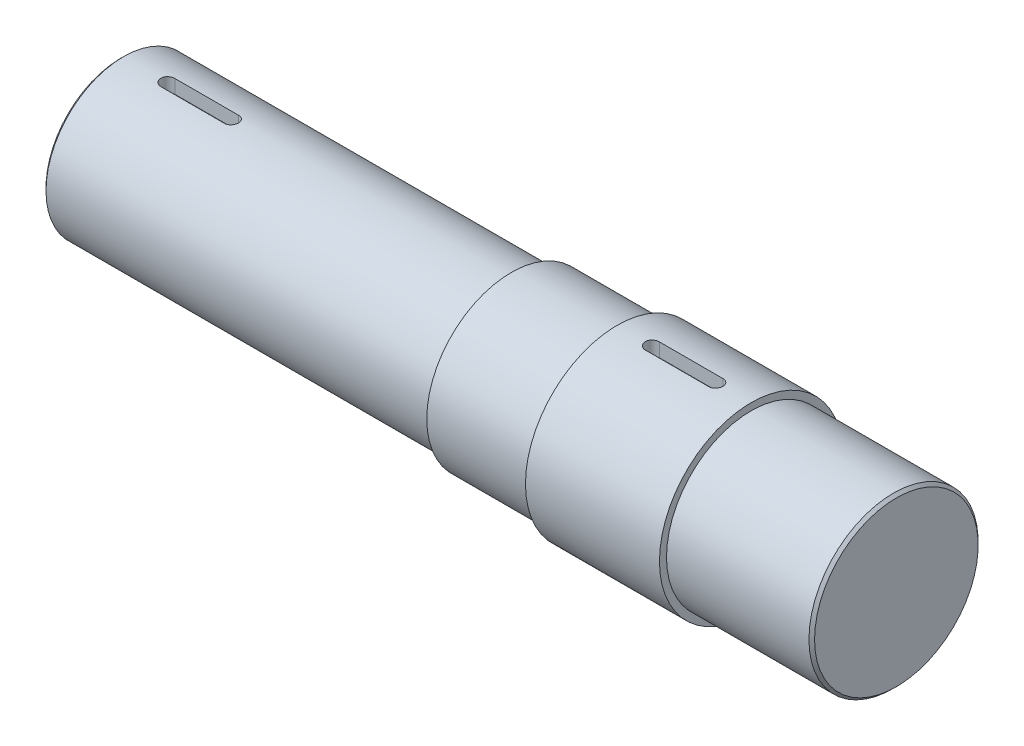
ISO-10303-21;
HEADER;
FILE_DESCRIPTION(('STEP AP214'),'2;1');
FILE_NAME('part.step','',(''),(''),'','','');
FILE_SCHEMA(('AUTOMOTIVE_DESIGN { 1 0 10303 214 1 1 1 1 }'));
ENDSEC;
DATA;
#1=APPLICATION_CONTEXT('core data for automotive mechanical design processes');
#2=APPLICATION_PROTOCOL_DEFINITION('international standard','automotive_design',2000,#1);
#3=PRODUCT_CONTEXT('',#1,'mechanical');
#4=PRODUCT('Part','Part','',(#3));
#5=PRODUCT_RELATED_PRODUCT_CATEGORY('part','',(#4));
#6=PRODUCT_DEFINITION_FORMATION('','',#4);
#7=PRODUCT_DEFINITION_CONTEXT('part definition',#1,'design');
#8=PRODUCT_DEFINITION('design','',#6,#7);
#9=PRODUCT_DEFINITION_SHAPE('','',#8);
#10=(LENGTH_UNIT() NAMED_UNIT(*) SI_UNIT(.MILLI.,.METRE.));
#11=(NAMED_UNIT(*) PLANE_ANGLE_UNIT() SI_UNIT($,.RADIAN.));
#12=(NAMED_UNIT(*) SI_UNIT($,.STERADIAN.) SOLID_ANGLE_UNIT());
#13=UNCERTAINTY_MEASURE_WITH_UNIT(LENGTH_MEASURE(1.E-05),#10,'distance_accuracy_value','');
#14=(GEOMETRIC_REPRESENTATION_CONTEXT(3) GLOBAL_UNCERTAINTY_ASSIGNED_CONTEXT((#13)) GLOBAL_UNIT_ASSIGNED_CONTEXT((#10,
#11,#12)) REPRESENTATION_CONTEXT('',''));
#15=CARTESIAN_POINT('',(0.,0.,0.));
#16=DIRECTION('',(0.,0.,1.));
#17=DIRECTION('',(1.,0.,0.));
#18=AXIS2_PLACEMENT_3D('',#15,#16,#17);
#19=CARTESIAN_POINT('',(0.,0.,0.));
#20=DIRECTION('',(-1.,0.,0.));
#21=DIRECTION('',(0.,0.,1.));
#22=AXIS2_PLACEMENT_3D('',#19,#20,#21);
#23=CYLINDRICAL_SURFACE('',#22,55.);
#24=CARTESIAN_POINT('',(277.,0.,0.));
#25=DIRECTION('',(-1.,0.,0.));
#26=DIRECTION('',(0.,0.,1.));
#27=AXIS2_PLACEMENT_3D('',#24,#25,#26);
#28=CIRCLE('',#27,55.);
#29=CARTESIAN_POINT('',(277.,0.,55.));
#30=VERTEX_POINT('',#29);
#31=EDGE_CURVE('E139',#30,#30,#28,.T.);
#32=ORIENTED_EDGE('',*,*,#31,.T.);
#33=EDGE_LOOP('',(#32));
#34=FACE_BOUND('',#33,.T.);
#35=CARTESIAN_POINT('',(1.99999999999999,0.,0.));
#36=DIRECTION('',(1.,0.,0.));
#37=DIRECTION('',(0.,0.,-1.));
#38=AXIS2_PLACEMENT_3D('',#35,#36,#37);
#39=CIRCLE('',#38,55.);
#40=CARTESIAN_POINT('',(1.99999999999999,0.,-55.));
#41=VERTEX_POINT('',#40);
#42=EDGE_CURVE('E167',#41,#41,#39,.T.);
#43=ORIENTED_EDGE('',*,*,#42,.T.);
#44=EDGE_LOOP('',(#43));
#45=FACE_BOUND('',#44,.T.);
#46=CARTESIAN_POINT('',(33.4902499755327,54.7722557505166,-5.));
#47=CARTESIAN_POINT('',(33.3499321169757,54.7722502668805,-5.00001544109722));
#48=CARTESIAN_POINT('',(33.2096168645877,54.7727947720944,-4.99409392388194));
#49=CARTESIAN_POINT('',(32.9299959325411,54.7749440965459,-4.97048879691858));
#50=CARTESIAN_POINT('',(32.7906901896279,54.7765488487584,-4.95280593068024));
#51=CARTESIAN_POINT('',(32.5141952991427,54.780777167758,-4.90581041083598));
#52=CARTESIAN_POINT('',(32.3770044111668,54.7833998445592,-4.87650791594956));
#53=CARTESIAN_POINT('',(32.105589785051,54.7895873975839,-4.80649093977446));
#54=CARTESIAN_POINT('',(31.9713660205379,54.793152265429,-4.76577655996419));
#55=CARTESIAN_POINT('',(31.7068066682247,54.8011238868613,-4.67321886613197));
#56=CARTESIAN_POINT('',(31.5764718978154,54.8055308160123,-4.62137323104368));
#57=CARTESIAN_POINT('',(31.3205914823056,54.8150623872163,-4.50690950853268));
#58=CARTESIAN_POINT('',(31.1950476255044,54.8201872939975,-4.44428744573984));
#59=CARTESIAN_POINT('',(30.9497449326892,54.8310054308812,-4.30876539400879));
#60=CARTESIAN_POINT('',(30.829983196707,54.8366983716041,-4.23587063067548));
#61=CARTESIAN_POINT('',(30.5969722736308,54.8484959633527,-4.08026691648593));
#62=CARTESIAN_POINT('',(30.4837255143265,54.85460076604,-3.99755434177018));
#63=CARTESIAN_POINT('',(30.2643401538923,54.8670618034721,-3.82272461793316));
#64=CARTESIAN_POINT('',(30.1582179765113,54.8734185688283,-3.73058689678663));
#65=CARTESIAN_POINT('',(29.9540672690979,54.8861931890398,-3.53767470847151));
#66=CARTESIAN_POINT('',(29.856041744848,54.8926110656045,-3.43689706188039));
#67=CARTESIAN_POINT('',(29.6688386072063,54.9053227200955,-3.22746610317823));
#68=CARTESIAN_POINT('',(29.5796590868612,54.9116165245328,-3.11881449725279));
#69=CARTESIAN_POINT('',(29.4107225438955,54.9239059204868,-2.89433852176803));
#70=CARTESIAN_POINT('',(29.3309690112198,54.9299014010771,-2.77851151958001));
#71=CARTESIAN_POINT('',(29.1813889063835,54.9414298436191,-2.5403765724821));
#72=CARTESIAN_POINT('',(29.1115757678484,54.9469621755827,-2.41806015821177));
#73=CARTESIAN_POINT('',(28.982479682398,54.9574003213832,-2.16790802057756));
#74=CARTESIAN_POINT('',(28.9232006424332,54.9623059025782,-2.04007027118744));
#75=CARTESIAN_POINT('',(28.8156564781675,54.9713466439967,-1.77988232007564));
#76=CARTESIAN_POINT('',(28.7673864563024,54.975482146653,-1.64753415513343));
#77=CARTESIAN_POINT('',(28.6821604760252,54.9828693572056,-1.37916942481402));
#78=CARTESIAN_POINT('',(28.6452086732369,54.9861207404376,-1.24315153194745));
#79=CARTESIAN_POINT('',(28.5830133687148,54.9916357582198,-0.96887827660991));
#80=CARTESIAN_POINT('',(28.557733647628,54.993902447039,-0.830631232317215));
#81=CARTESIAN_POINT('',(28.5188797629795,54.9974016121084,-0.552492560979599));
#82=CARTESIAN_POINT('',(28.5053096711726,54.9986337286058,-0.412600379001498));
#83=CARTESIAN_POINT('',(28.4824046268552,55.0007091235649,0.00805572211882679));
#84=CARTESIAN_POINT('',(28.490808149364,54.9999375178733,0.29009439360317));
#85=CARTESIAN_POINT('',(28.5386653619845,54.9956187209365,0.708208728630727));
#86=CARTESIAN_POINT('',(28.5604555133076,54.9936556021306,0.846626404986471));
#87=CARTESIAN_POINT('',(28.6155598924876,54.9887426133283,1.1211344634281));
#88=CARTESIAN_POINT('',(28.6488701143573,54.9857930863571,1.25722563729018));
#89=CARTESIAN_POINT('',(28.7267957622784,54.9789869007526,1.52614685238521));
#90=CARTESIAN_POINT('',(28.7714152346039,54.9751299174811,1.65897570771416));
#91=CARTESIAN_POINT('',(28.8716124804218,54.9666200584011,1.92035554928146));
#92=CARTESIAN_POINT('',(28.9271862694044,54.9619674720656,2.04890807117545));
#93=CARTESIAN_POINT('',(29.049018637502,54.9519867341246,2.30111156445695));
#94=CARTESIAN_POINT('',(29.1152967881715,54.9466573489677,2.42475303062512));
#95=CARTESIAN_POINT('',(29.257966105853,54.9354819174042,2.665970910698));
#96=CARTESIAN_POINT('',(29.3343535759036,54.9296360601293,2.78354952004053));
#97=CARTESIAN_POINT('',(29.4967478307551,54.9175882866648,3.0119058862921));
#98=CARTESIAN_POINT('',(29.5827578922439,54.9113862495408,3.122681306566));
#99=CARTESIAN_POINT('',(29.7637373368852,54.8988046622886,3.33657344208728));
#100=CARTESIAN_POINT('',(29.8587034383492,54.8924251777806,3.43969293806903));
#101=CARTESIAN_POINT('',(30.0573391900487,54.8796412013351,3.63797920941729));
#102=CARTESIAN_POINT('',(30.1610410250545,54.873236707933,3.73311374642043));
#103=CARTESIAN_POINT('',(30.376059079677,54.8606113134387,3.91427786267554));
#104=CARTESIAN_POINT('',(30.4873724892503,54.8543903457936,4.00031077250925));
#105=CARTESIAN_POINT('',(30.7169421285245,54.8423020245952,4.16275746219534));
#106=CARTESIAN_POINT('',(30.8352030194182,54.8364349139254,4.23916467337636));
#107=CARTESIAN_POINT('',(31.0777190362545,54.8252281489868,4.38172010006373));
#108=CARTESIAN_POINT('',(31.2019719150905,54.81988829924,4.44787212282865));
#109=CARTESIAN_POINT('',(31.4557778483124,54.8098803275767,4.56954606869714));
#110=CARTESIAN_POINT('',(31.5853367596576,54.8052129751311,4.62505583857091));
#111=CARTESIAN_POINT('',(31.8486519928538,54.7966927641357,4.72493123746431));
#112=CARTESIAN_POINT('',(31.982406704073,54.792839597336,4.76930108524979));
#113=CARTESIAN_POINT('',(32.2530544275722,54.7860600051886,4.84655882942857));
#114=CARTESIAN_POINT('',(32.389943872911,54.783132577677,4.87945914620053));
#115=CARTESIAN_POINT('',(32.6659719917745,54.7782840976146,4.93359216845149));
#116=CARTESIAN_POINT('',(32.8051095348616,54.7763625545593,4.95483056093913));
#117=CARTESIAN_POINT('',(33.0354885659596,54.7740686057276,4.98011102628725));
#118=CARTESIAN_POINT('',(33.1263656612475,54.7733890531006,4.98757396642762));
#119=CARTESIAN_POINT('',(33.3082420753506,54.7724826101143,4.99751500188472));
#120=CARTESIAN_POINT('',(33.3992409366275,54.7722549657277,5.00000140081968));
#121=CARTESIAN_POINT('',(33.4902499755327,54.7722557505166,5.));
#122=B_SPLINE_CURVE_WITH_KNOTS('',3,(#46,#47,#48,#49,#50,#51,#52,#53,#54,#55,#56,#57,#58,#59,
#60,#61,#62,#63,#64,#65,#66,#67,#68,#69,#70,#71,#72,#73,#74,#75,#76,#77,#78,#79,#80,#81,#82,#83,
#84,#85,#86,#87,#88,#89,#90,#91,#92,#93,#94,#95,#96,#97,#98,#99,#100,#101,#102,#103,#104,#105,
#106,#107,#108,#109,#110,#111,#112,#113,#114,#115,#116,#117,#118,#119,#120,#121),.UNSPECIFIED.,
.F.,.F.,(4,2,2,2,2,2,2,2,2,2,2,2,2,2,2,2,2,2,2,2,2,2,2,2,2,2,2,2,2,2,2,2,2,2,2,2,2,4),(0.,
0.42082387102169,0.841621141616194,1.26205132906491,1.68247777802189,2.10299197872289,
2.52366163884861,2.94411807642996,3.36473019444176,3.78628079631638,4.20798719677977,
4.62960249055763,5.05137340038744,5.47370899631445,5.8962009051893,6.31850449255451,
6.74096294853787,7.16210152478432,7.58338648336551,8.42505922213688,8.84509417341362,
9.26498320843461,9.68502268581445,10.1049096595448,10.5255732195796,10.9460833665486,
11.366737144117,11.7872373794437,12.2093609582421,12.6313295300485,13.0535845152495,
13.4756823601035,13.898259397524,14.3206761598735,14.7426340548491,15.1643859963178,
15.4378152874789,15.7107879660148),.UNSPECIFIED.);
#123=CARTESIAN_POINT('',(33.4902499755327,54.7722557505166,-5.));
#124=VERTEX_POINT('',#123);
#125=CARTESIAN_POINT('',(33.4902499755327,54.7722557505166,5.));
#126=VERTEX_POINT('',#125);
#127=EDGE_CURVE('E224',#124,#126,#122,.T.);
#128=ORIENTED_EDGE('',*,*,#127,.F.);
#129=DIRECTION('',(-1.,0.,0.));
#130=VECTOR('',#129,1.);
#131=CARTESIAN_POINT('',(0.,54.7722557505166,-5.));
#132=LINE('',#131,#130);
#133=CARTESIAN_POINT('',(78.4902499755327,54.7722557505166,-5.));
#134=VERTEX_POINT('',#133);
#135=EDGE_CURVE('E11',#134,#124,#132,.T.);
#136=ORIENTED_EDGE('',*,*,#135,.F.);
#137=CARTESIAN_POINT('',(78.4902499755327,54.7722557505166,-5.));
#138=CARTESIAN_POINT('',(78.6305678340897,54.7722502668805,-5.00001544109722));
#139=CARTESIAN_POINT('',(78.7708830864778,54.7727947720944,-4.99409392388194));
#140=CARTESIAN_POINT('',(79.0505040185244,54.7749440965459,-4.97048879691858));
#141=CARTESIAN_POINT('',(79.1898097614376,54.7765488487584,-4.95280593068024));
#142=CARTESIAN_POINT('',(79.4663046519228,54.780777167758,-4.90581041083598));
#143=CARTESIAN_POINT('',(79.6034955398986,54.7833998445592,-4.87650791594956));
#144=CARTESIAN_POINT('',(79.8749101660144,54.7895873975839,-4.80649093977446));
#145=CARTESIAN_POINT('',(80.0091339305276,54.793152265429,-4.76577655996419));
#146=CARTESIAN_POINT('',(80.2736932828408,54.8011238868613,-4.67321886613197));
#147=CARTESIAN_POINT('',(80.40402805325,54.8055308160123,-4.62137323104368));
#148=CARTESIAN_POINT('',(80.6599084687598,54.8150623872163,-4.50690950853268));
#149=CARTESIAN_POINT('',(80.7854523255611,54.8201872939975,-4.44428744573985));
#150=CARTESIAN_POINT('',(81.0307550183762,54.8310054308812,-4.3087653940088));
#151=CARTESIAN_POINT('',(81.1505167543584,54.8366983716041,-4.23587063067548));
#152=CARTESIAN_POINT('',(81.3835276774347,54.8484959633527,-4.08026691648593));
#153=CARTESIAN_POINT('',(81.4967744367389,54.85460076604,-3.99755434177018));
#154=CARTESIAN_POINT('',(81.7161597971732,54.8670618034721,-3.82272461793316));
#155=CARTESIAN_POINT('',(81.8222819745542,54.8734185688283,-3.73058689678663));
#156=CARTESIAN_POINT('',(82.0264326819676,54.8861931890398,-3.53767470847152));
#157=CARTESIAN_POINT('',(82.1244582062174,54.8926110656045,-3.4368970618804));
#158=CARTESIAN_POINT('',(82.3116613438591,54.9053227200955,-3.22746610317825));
#159=CARTESIAN_POINT('',(82.4008408642043,54.9116165245328,-3.1188144972528));
#160=CARTESIAN_POINT('',(82.5697774071699,54.9239059204868,-2.89433852176805));
#161=CARTESIAN_POINT('',(82.6495309398456,54.9299014010771,-2.77851151958002));
#162=CARTESIAN_POINT('',(82.799111044682,54.9414298436191,-2.54037657248211));
#163=CARTESIAN_POINT('',(82.8689241832171,54.9469621755827,-2.41806015821178));
#164=CARTESIAN_POINT('',(82.9980202686675,54.9574003213832,-2.16790802057758));
#165=CARTESIAN_POINT('',(83.0572993086322,54.9623059025782,-2.04007027118746));
#166=CARTESIAN_POINT('',(83.164843472898,54.9713466439967,-1.77988232007566));
#167=CARTESIAN_POINT('',(83.213113494763,54.975482146653,-1.64753415513345));
#168=CARTESIAN_POINT('',(83.2983394750402,54.9828693572056,-1.37916942481404));
#169=CARTESIAN_POINT('',(83.3352912778286,54.9861207404376,-1.24315153194746));
#170=CARTESIAN_POINT('',(83.3974865823507,54.9916357582198,-0.968878276609925));
#171=CARTESIAN_POINT('',(83.4227663034374,54.993902447039,-0.830631232317231));
#172=CARTESIAN_POINT('',(83.461620188086,54.9974016121084,-0.552492560979614));
#173=CARTESIAN_POINT('',(83.4751902798928,54.9986337286058,-0.412600379001512));
#174=CARTESIAN_POINT('',(83.4980953242102,55.0007091235649,0.00805572211881503));
#175=CARTESIAN_POINT('',(83.4896918017014,54.9999375178733,0.290094393603158));
#176=CARTESIAN_POINT('',(83.441834589081,54.9956187209365,0.708208728630717));
#177=CARTESIAN_POINT('',(83.4200444377579,54.9936556021306,0.846626404986461));
#178=CARTESIAN_POINT('',(83.3649400585778,54.9887426133283,1.12113446342809));
#179=CARTESIAN_POINT('',(83.3316298367082,54.9857930863571,1.25722563729017));
#180=CARTESIAN_POINT('',(83.2537041887871,54.9789869007526,1.5261468523852));
#181=CARTESIAN_POINT('',(83.2090847164616,54.9751299174811,1.65897570771415));
#182=CARTESIAN_POINT('',(83.1088874706436,54.9666200584011,1.92035554928146));
#183=CARTESIAN_POINT('',(83.0533136816611,54.9619674720656,2.04890807117544));
#184=CARTESIAN_POINT('',(82.9314813135634,54.9519867341246,2.30111156445694));
#185=CARTESIAN_POINT('',(82.865203162894,54.9466573489677,2.42475303062511));
#186=CARTESIAN_POINT('',(82.7225338452124,54.9354819174042,2.66597091069799));
#187=CARTESIAN_POINT('',(82.6461463751619,54.9296360601293,2.78354952004052));
#188=CARTESIAN_POINT('',(82.4837521203104,54.9175882866648,3.01190588629208));
#189=CARTESIAN_POINT('',(82.3977420588216,54.9113862495408,3.12268130656598));
#190=CARTESIAN_POINT('',(82.2167626141803,54.8988046622886,3.33657344208727));
#191=CARTESIAN_POINT('',(82.1217965127163,54.8924251777806,3.43969293806902));
#192=CARTESIAN_POINT('',(81.9231607610168,54.8796412013351,3.63797920941729));
#193=CARTESIAN_POINT('',(81.8194589260109,54.873236707933,3.73311374642042));
#194=CARTESIAN_POINT('',(81.6044408713885,54.8606113134387,3.91427786267553));
#195=CARTESIAN_POINT('',(81.4931274618152,54.8543903457936,4.00031077250925));
#196=CARTESIAN_POINT('',(81.263557822541,54.8423020245952,4.16275746219532));
#197=CARTESIAN_POINT('',(81.1452969316473,54.8364349139254,4.23916467337635));
#198=CARTESIAN_POINT('',(80.902780914811,54.8252281489868,4.38172010006371));
#199=CARTESIAN_POINT('',(80.778528035975,54.81988829924,4.44787212282864));
#200=CARTESIAN_POINT('',(80.524722102753,54.8098803275767,4.56954606869714));
#201=CARTESIAN_POINT('',(80.3951631914079,54.8052129751311,4.62505583857091));
#202=CARTESIAN_POINT('',(80.1318479582117,54.7966927641357,4.72493123746431));
#203=CARTESIAN_POINT('',(79.9980932469925,54.792839597336,4.76930108524979));
#204=CARTESIAN_POINT('',(79.7274455234933,54.7860600051886,4.84655882942857));
#205=CARTESIAN_POINT('',(79.5905560781545,54.783132577677,4.87945914620052));
#206=CARTESIAN_POINT('',(79.314527959291,54.7782840976146,4.93359216845148));
#207=CARTESIAN_POINT('',(79.1753904162039,54.7763625545593,4.95483056093913));
#208=CARTESIAN_POINT('',(78.9450113851059,54.7740686057276,4.98011102628725));
#209=CARTESIAN_POINT('',(78.8541342898179,54.7733890531006,4.98757396642762));
#210=CARTESIAN_POINT('',(78.6722578757148,54.7724826101143,4.99751500188472));
#211=CARTESIAN_POINT('',(78.5812590144379,54.7722549657277,5.00000140081968));
#212=CARTESIAN_POINT('',(78.4902499755327,54.7722557505166,5.));
#213=B_SPLINE_CURVE_WITH_KNOTS('',3,(#137,#138,#139,#140,#141,#142,#143,#144,#145,#146,#147,
#148,#149,#150,#151,#152,#153,#154,#155,#156,#157,#158,#159,#160,#161,#162,#163,#164,#165,#166,
#167,#168,#169,#170,#171,#172,#173,#174,#175,#176,#177,#178,#179,#180,#181,#182,#183,#184,#185,
#186,#187,#188,#189,#190,#191,#192,#193,#194,#195,#196,#197,#198,#199,#200,#201,#202,#203,#204,
#205,#206,#207,#208,#209,#210,#211,#212),.UNSPECIFIED.,.F.,.F.,(4,2,2,2,2,2,2,2,2,2,2,2,2,2,2,2,
2,2,2,2,2,2,2,2,2,2,2,2,2,2,2,2,2,2,2,2,2,4),(0.,0.420823871021704,0.841621141616208,
1.2620513290649,1.68247777802188,2.10299197872288,2.5236616388486,2.94411807642996,
3.36473019444176,3.78628079631638,4.20798719677976,4.62960249055761,5.05137340038743,
5.47370899631443,5.89620090518928,6.31850449255449,6.74096294853785,7.16210152478431,
7.5833864833655,8.42505922213687,8.84509417341361,9.2649832084346,9.68502268581444,
10.1049096595448,10.5255732195796,10.9460833665486,11.366737144117,11.7872373794437,
12.2093609582421,12.6313295300485,13.0535845152494,13.4756823601035,13.898259397524,
14.3206761598735,14.7426340548491,15.1643859963178,15.4378152874789,15.7107879660148),.UNSPECIFIED.);
#214=CARTESIAN_POINT('',(78.4902499755327,54.7722557505166,5.));
#215=VERTEX_POINT('',#214);
#216=EDGE_CURVE('E216',#134,#215,#213,.T.);
#217=ORIENTED_EDGE('',*,*,#216,.T.);
#218=DIRECTION('',(-1.,0.,0.));
#219=VECTOR('',#218,1.);
#220=CARTESIAN_POINT('',(0.,54.7722557505166,5.));
#221=LINE('',#220,#219);
#222=EDGE_CURVE('E44',#215,#126,#221,.T.);
#223=ORIENTED_EDGE('',*,*,#222,.T.);
#224=EDGE_LOOP('',(#128,#136,#217,#223));
#225=FACE_BOUND('',#224,.T.);
#226=ADVANCED_FACE('F36',(#34,#45,#225),#23,.T.);
#227=CARTESIAN_POINT('',(0.,0.,0.));
#228=DIRECTION('',(-1.,0.,0.));
#229=DIRECTION('',(0.,0.,1.));
#230=AXIS2_PLACEMENT_3D('',#227,#228,#229);
#231=CYLINDRICAL_SURFACE('',#230,65.);
#232=CARTESIAN_POINT('',(447.,0.,0.));
#233=DIRECTION('',(-1.,0.,0.));
#234=DIRECTION('',(0.,0.,1.));
#235=AXIS2_PLACEMENT_3D('',#232,#233,#234);
#236=CIRCLE('',#235,65.);
#237=CARTESIAN_POINT('',(447.,0.,65.));
#238=VERTEX_POINT('',#237);
#239=EDGE_CURVE('E158',#238,#238,#236,.T.);
#240=ORIENTED_EDGE('',*,*,#239,.T.);
#241=EDGE_LOOP('',(#240));
#242=FACE_BOUND('',#241,.T.);
#243=CARTESIAN_POINT('',(352.,0.,0.));
#244=DIRECTION('',(-1.,0.,0.));
#245=DIRECTION('',(0.,0.,1.));
#246=AXIS2_PLACEMENT_3D('',#243,#244,#245);
#247=CIRCLE('',#246,65.);
#248=CARTESIAN_POINT('',(352.,0.,65.));
#249=VERTEX_POINT('',#248);
#250=EDGE_CURVE('E155',#249,#249,#247,.T.);
#251=ORIENTED_EDGE('',*,*,#250,.F.);
#252=EDGE_LOOP('',(#251));
#253=FACE_BOUND('',#252,.T.);
#254=CARTESIAN_POINT('',(377.,64.8074069840786,-5.));
#255=CARTESIAN_POINT('',(376.859594385389,64.8074023551756,-5.00001535000786));
#256=CARTESIAN_POINT('',(376.7191912536,64.8078631108014,-4.99408652774138));
#257=CARTESIAN_POINT('',(376.439393562403,64.8096819189454,-4.97045161976289));
#258=CARTESIAN_POINT('',(376.299998944139,64.8110399186659,-4.95274622703354));
#259=CARTESIAN_POINT('',(376.023319197556,64.8146182748958,-4.90568863561711));
#260=CARTESIAN_POINT('',(375.886032425275,64.8168379197219,-4.87634604833895));
#261=CARTESIAN_POINT('',(375.614426694473,64.8220748519402,-4.80623084978102));
#262=CARTESIAN_POINT('',(375.480107706815,64.8250921314972,-4.76545835077682));
#263=CARTESIAN_POINT('',(375.215357239324,64.8318396227245,-4.67276436747024));
#264=CARTESIAN_POINT('',(375.084926663913,64.8355699987841,-4.62084031207091));
#265=CARTESIAN_POINT('',(374.828859832242,64.8436385922533,-4.50619969022729));
#266=CARTESIAN_POINT('',(374.703225365893,64.8479770338254,-4.4434791417174));
#267=CARTESIAN_POINT('',(374.457752351393,64.8571351886751,-4.30774153614573));
#268=CARTESIAN_POINT('',(374.337910803176,64.8619546487893,-4.23472988710659));
#269=CARTESIAN_POINT('',(374.104752873588,64.8719421824066,-4.07887420457044));
#270=CARTESIAN_POINT('',(373.991438922478,64.8771103842128,-3.99602654376242));
#271=CARTESIAN_POINT('',(373.772016258818,64.8876556011665,-3.82097472068715));
#272=CARTESIAN_POINT('',(373.665918595848,64.8930329175663,-3.72875672604966));
#273=CARTESIAN_POINT('',(373.461825163887,64.9038387929242,-3.53568366332888));
#274=CARTESIAN_POINT('',(373.363832403002,64.9092673700819,-3.43482541646755));
#275=CARTESIAN_POINT('',(373.176704756578,64.9200189480372,-3.22523570437237));
#276=CARTESIAN_POINT('',(373.08756796015,64.9253419714113,-3.1165059463986));
#277=CARTESIAN_POINT('',(372.91872766097,64.9357349904512,-2.89187905339641));
#278=CARTESIAN_POINT('',(372.839027652656,64.9408048919869,-2.775979287355));
#279=CARTESIAN_POINT('',(372.689602790967,64.9505501019168,-2.53776683499873));
#280=CARTESIAN_POINT('',(372.619886353476,64.9552250760523,-2.41544885559437));
#281=CARTESIAN_POINT('',(372.490982542369,64.9640446716844,-2.16530962048204));
#282=CARTESIAN_POINT('',(372.431799072257,64.968189096401,-2.0374863462248));
#283=CARTESIAN_POINT('',(372.324442187587,64.9758260627094,-1.77734318588319));
#284=CARTESIAN_POINT('',(372.276263918539,64.9793188916007,-1.64502531210825));
#285=CARTESIAN_POINT('',(372.191215187684,64.9855569579573,-1.37673665998182));
#286=CARTESIAN_POINT('',(372.154348883385,64.9883019205165,-1.24076455850589));
#287=CARTESIAN_POINT('',(372.092290861164,64.9929584069652,-0.966488011494478));
#288=CARTESIAN_POINT('',(372.067072071349,64.9948718628766,-0.828189756618804));
#289=CARTESIAN_POINT('',(372.028347640301,64.9978229730796,-0.549957312961379));
#290=CARTESIAN_POINT('',(372.014846074,64.998860322682,-0.410022572187263));
#291=CARTESIAN_POINT('',(371.992155611716,65.0005999767008,0.0107514264044203));
#292=CARTESIAN_POINT('',(372.000714766538,64.9999349793205,0.292853804254978));
#293=CARTESIAN_POINT('',(372.048835361242,64.996260788839,0.71116919816126));
#294=CARTESIAN_POINT('',(372.070734805228,64.9945915452053,0.849728701831299));
#295=CARTESIAN_POINT('',(372.126083432708,64.9904167160765,1.12451225954851));
#296=CARTESIAN_POINT('',(372.159528600663,64.9879114213657,1.26073710830887));
#297=CARTESIAN_POINT('',(372.237749969632,64.982132276683,1.52991535250005));
#298=CARTESIAN_POINT('',(372.282530215637,64.9788581523802,1.66286756144681));
#299=CARTESIAN_POINT('',(372.383074623856,64.9716360098702,1.92448062261232));
#300=CARTESIAN_POINT('',(372.438834777316,64.9676882376814,2.05314302104981));
#301=CARTESIAN_POINT('',(372.561040464033,64.9592229303753,2.30549832392574));
#302=CARTESIAN_POINT('',(372.627501321586,64.954704580175,2.42918377861648));
#303=CARTESIAN_POINT('',(372.770551251445,64.9452319076253,2.67047311832818));
#304=CARTESIAN_POINT('',(372.847136608733,64.9402777454121,2.78807921215766));
#305=CARTESIAN_POINT('',(373.009939387065,64.9300699533595,3.01646975085982));
#306=CARTESIAN_POINT('',(373.09616003043,64.9248162236255,3.12725189427555));
#307=CARTESIAN_POINT('',(373.277570361244,64.9141609293724,3.34113367429633));
#308=CARTESIAN_POINT('',(373.372756752784,64.908759419693,3.4442361092811));
#309=CARTESIAN_POINT('',(373.571737226183,64.8979436628168,3.64235933169006));
#310=CARTESIAN_POINT('',(373.675554913318,64.8925294228504,3.7373564138833));
#311=CARTESIAN_POINT('',(373.89079044213,64.8818590830606,3.91823552386131));
#312=CARTESIAN_POINT('',(374.002205475102,64.8766029258192,4.00412089051489));
#313=CARTESIAN_POINT('',(374.23196174368,64.866392367416,4.16626296509967));
#314=CARTESIAN_POINT('',(374.35030764551,64.8614381742402,4.24251307442662));
#315=CARTESIAN_POINT('',(374.592974296845,64.8519782386827,4.38474619420972));
#316=CARTESIAN_POINT('',(374.717292811516,64.84747233047,4.45073300642221));
#317=CARTESIAN_POINT('',(374.971201330601,64.8390307558136,4.57206685064607));
#318=CARTESIAN_POINT('',(375.100796865895,64.8350957084786,4.62740235206201));
#319=CARTESIAN_POINT('',(375.364162859338,64.8279156314631,4.72692767521658));
#320=CARTESIAN_POINT('',(375.497931719274,64.8246703412647,4.77112170621339));
#321=CARTESIAN_POINT('',(375.768585037949,64.8189640208537,4.84802947153242));
#322=CARTESIAN_POINT('',(375.905465939977,64.816502139248,4.88075567281092));
#323=CARTESIAN_POINT('',(376.181456718038,64.8124292954725,4.9345453971113));
#324=CARTESIAN_POINT('',(376.320565471234,64.8108179177424,4.95561461603376));
#325=CARTESIAN_POINT('',(376.549973015629,64.8089073794513,4.98052378608666));
#326=CARTESIAN_POINT('',(376.639907523471,64.8083449361425,4.98783190037653));
#327=CARTESIAN_POINT('',(376.819891612615,64.8075947360562,4.99756659152388));
#328=CARTESIAN_POINT('',(376.90994075269,64.8074063567063,5.00000127951192));
#329=CARTESIAN_POINT('',(377.,64.8074069840786,5.));
#330=B_SPLINE_CURVE_WITH_KNOTS('',3,(#254,#255,#256,#257,#258,#259,#260,#261,#262,#263,#264,
#265,#266,#267,#268,#269,#270,#271,#272,#273,#274,#275,#276,#277,#278,#279,#280,#281,#282,#283,
#284,#285,#286,#287,#288,#289,#290,#291,#292,#293,#294,#295,#296,#297,#298,#299,#300,#301,#302,
#303,#304,#305,#306,#307,#308,#309,#310,#311,#312,#313,#314,#315,#316,#317,#318,#319,#320,#321,
#322,#323,#324,#325,#326,#327,#328,#329),.UNSPECIFIED.,.F.,.F.,(4,2,2,2,2,2,2,2,2,2,2,2,2,2,2,2,
2,2,2,2,2,2,2,2,2,2,2,2,2,2,2,2,2,2,2,2,2,4),(0.,0.421087406559349,0.842150036766591,
1.26286562412243,1.68357707895017,2.10438563711996,2.52534973578104,2.94609343488592,
3.36699278007518,3.78852273606694,4.21020844589851,4.63180296832185,5.05355312191938,
5.47565673281538,5.89791645048798,6.31998954448485,6.74221757850417,7.16345924252506,
7.58484734430108,8.42673213288286,8.84722631357802,9.26757439576205,9.68807269362951,
10.1084177516206,10.5293702222734,10.9501686578773,11.3711082442778,11.7918936880352,
12.2138703640184,12.6356918741753,13.0578007165174,13.479752825933,13.9021591825692,
14.3244057137157,14.7461917758258,15.1677715600201,15.4383468419485,15.7084714137935),.UNSPECIFIED.);
#331=CARTESIAN_POINT('',(377.,64.8074069840786,-5.));
#332=VERTEX_POINT('',#331);
#333=CARTESIAN_POINT('',(377.,64.8074069840786,5.));
#334=VERTEX_POINT('',#333);
#335=EDGE_CURVE('E185',#332,#334,#330,.T.);
#336=ORIENTED_EDGE('',*,*,#335,.F.);
#337=DIRECTION('',(-1.,0.,0.));
#338=VECTOR('',#337,1.);
#339=CARTESIAN_POINT('',(0.,64.8074069840786,-5.));
#340=LINE('',#339,#338);
#341=CARTESIAN_POINT('',(422.,64.8074069840786,-5.));
#342=VERTEX_POINT('',#341);
#343=EDGE_CURVE('E249',#342,#332,#340,.T.);
#344=ORIENTED_EDGE('',*,*,#343,.F.);
#345=CARTESIAN_POINT('',(422.,64.8074069840786,-5.));
#346=CARTESIAN_POINT('',(422.140405614611,64.8074023551756,-5.00001535000786));
#347=CARTESIAN_POINT('',(422.2808087464,64.8078631108014,-4.99408652774137));
#348=CARTESIAN_POINT('',(422.560606437597,64.8096819189454,-4.97045161976288));
#349=CARTESIAN_POINT('',(422.700001055861,64.8110399186659,-4.95274622703352));
#350=CARTESIAN_POINT('',(422.976680802444,64.8146182748958,-4.9056886356171));
#351=CARTESIAN_POINT('',(423.113967574726,64.8168379197219,-4.87634604833894));
#352=CARTESIAN_POINT('',(423.385573305527,64.8220748519402,-4.806230849781));
#353=CARTESIAN_POINT('',(423.519892293185,64.8250921314972,-4.76545835077681));
#354=CARTESIAN_POINT('',(423.784642760676,64.8318396227245,-4.67276436747024));
#355=CARTESIAN_POINT('',(423.915073336087,64.8355699987841,-4.62084031207092));
#356=CARTESIAN_POINT('',(424.171140167758,64.8436385922533,-4.50619969022733));
#357=CARTESIAN_POINT('',(424.296774634107,64.8479770338254,-4.44347914171744));
#358=CARTESIAN_POINT('',(424.542247648607,64.8571351886751,-4.30774153614578));
#359=CARTESIAN_POINT('',(424.662089196824,64.8619546487893,-4.23472988710663));
#360=CARTESIAN_POINT('',(424.895247126412,64.8719421824066,-4.07887420457047));
#361=CARTESIAN_POINT('',(425.008561077522,64.8771103842128,-3.99602654376242));
#362=CARTESIAN_POINT('',(425.227983741182,64.8876556011665,-3.82097472068716));
#363=CARTESIAN_POINT('',(425.334081404152,64.8930329175663,-3.72875672604969));
#364=CARTESIAN_POINT('',(425.538174836113,64.9038387929242,-3.53568366332891));
#365=CARTESIAN_POINT('',(425.636167596998,64.9092673700819,-3.43482541646757));
#366=CARTESIAN_POINT('',(425.823295243422,64.9200189480372,-3.2252357043724));
#367=CARTESIAN_POINT('',(425.91243203985,64.9253419714113,-3.11650594639866));
#368=CARTESIAN_POINT('',(426.08127233903,64.9357349904512,-2.89187905339646));
#369=CARTESIAN_POINT('',(426.160972347344,64.9408048919869,-2.77597928735502));
#370=CARTESIAN_POINT('',(426.310397209033,64.9505501019168,-2.53776683499873));
#371=CARTESIAN_POINT('',(426.380113646524,64.9552250760523,-2.41544885559439));
#372=CARTESIAN_POINT('',(426.509017457631,64.9640446716844,-2.16530962048205));
#373=CARTESIAN_POINT('',(426.568200927743,64.968189096401,-2.03748634622479));
#374=CARTESIAN_POINT('',(426.675557812414,64.9758260627094,-1.77734318588317));
#375=CARTESIAN_POINT('',(426.723736081461,64.9793188916007,-1.64502531210824));
#376=CARTESIAN_POINT('',(426.808784812316,64.9855569579573,-1.37673665998182));
#377=CARTESIAN_POINT('',(426.845651116615,64.9883019205165,-1.24076455850589));
#378=CARTESIAN_POINT('',(426.907709138836,64.9929584069652,-0.966488011494475));
#379=CARTESIAN_POINT('',(426.932927928651,64.9948718628766,-0.828189756618801));
#380=CARTESIAN_POINT('',(426.971652359699,64.9978229730796,-0.549957312961378));
#381=CARTESIAN_POINT('',(426.985153926,64.998860322682,-0.410022572187262));
#382=CARTESIAN_POINT('',(427.007844388284,65.0005999767008,0.0107514264044214));
#383=CARTESIAN_POINT('',(426.999285233462,64.9999349793205,0.29285380425498));
#384=CARTESIAN_POINT('',(426.951164638758,64.996260788839,0.711169198161267));
#385=CARTESIAN_POINT('',(426.929265194773,64.9945915452053,0.84972870183131));
#386=CARTESIAN_POINT('',(426.873916567292,64.9904167160765,1.12451225954852));
#387=CARTESIAN_POINT('',(426.840471399338,64.9879114213657,1.26073710830888));
#388=CARTESIAN_POINT('',(426.762250030368,64.982132276683,1.52991535250005));
#389=CARTESIAN_POINT('',(426.717469784364,64.9788581523802,1.66286756144681));
#390=CARTESIAN_POINT('',(426.616925376144,64.9716360098702,1.92448062261233));
#391=CARTESIAN_POINT('',(426.561165222684,64.9676882376814,2.05314302104982));
#392=CARTESIAN_POINT('',(426.438959535967,64.9592229303753,2.30549832392573));
#393=CARTESIAN_POINT('',(426.372498678414,64.954704580175,2.42918377861644));
#394=CARTESIAN_POINT('',(426.229448748555,64.9452319076254,2.67047311832813));
#395=CARTESIAN_POINT('',(426.152863391267,64.9402777454121,2.78807921215763));
#396=CARTESIAN_POINT('',(425.990060612935,64.9300699533595,3.01646975085979));
#397=CARTESIAN_POINT('',(425.903839969571,64.9248162236255,3.1272518942755));
#398=CARTESIAN_POINT('',(425.722429638756,64.9141609293724,3.34113367429629));
#399=CARTESIAN_POINT('',(425.627243247216,64.908759419693,3.44423610928109));
#400=CARTESIAN_POINT('',(425.428262773817,64.8979436628168,3.64235933169008));
#401=CARTESIAN_POINT('',(425.324445086682,64.8925294228504,3.73735641388333));
#402=CARTESIAN_POINT('',(425.10920955787,64.8818590830605,3.91823552386135));
#403=CARTESIAN_POINT('',(424.997794524898,64.8766029258192,4.00412089051493));
#404=CARTESIAN_POINT('',(424.768038256321,64.866392367416,4.16626296509971));
#405=CARTESIAN_POINT('',(424.64969235449,64.8614381742402,4.24251307442665));
#406=CARTESIAN_POINT('',(424.407025703155,64.8519782386827,4.38474619420973));
#407=CARTESIAN_POINT('',(424.282707188484,64.84747233047,4.45073300642222));
#408=CARTESIAN_POINT('',(424.028798669399,64.8390307558136,4.57206685064608));
#409=CARTESIAN_POINT('',(423.899203134106,64.8350957084786,4.62740235206202));
#410=CARTESIAN_POINT('',(423.635837140662,64.8279156314631,4.7269276752166));
#411=CARTESIAN_POINT('',(423.502068280726,64.8246703412647,4.77112170621341));
#412=CARTESIAN_POINT('',(423.231414962051,64.8189640208537,4.84802947153242));
#413=CARTESIAN_POINT('',(423.094534060023,64.816502139248,4.88075567281092));
#414=CARTESIAN_POINT('',(422.818543281962,64.8124292954725,4.93454539711129));
#415=CARTESIAN_POINT('',(422.679434528766,64.8108179177424,4.95561461603377));
#416=CARTESIAN_POINT('',(422.450026984371,64.8089073794513,4.98052378608667));
#417=CARTESIAN_POINT('',(422.360092476529,64.8083449361425,4.98783190037654));
#418=CARTESIAN_POINT('',(422.180108387385,64.8075947360562,4.99756659152389));
#419=CARTESIAN_POINT('',(422.09005924731,64.8074063567063,5.00000127951192));
#420=CARTESIAN_POINT('',(422.,64.8074069840786,5.));
#421=B_SPLINE_CURVE_WITH_KNOTS('',3,(#345,#346,#347,#348,#349,#350,#351,#352,#353,#354,#355,
#356,#357,#358,#359,#360,#361,#362,#363,#364,#365,#366,#367,#368,#369,#370,#371,#372,#373,#374,
#375,#376,#377,#378,#379,#380,#381,#382,#383,#384,#385,#386,#387,#388,#389,#390,#391,#392,#393,
#394,#395,#396,#397,#398,#399,#400,#401,#402,#403,#404,#405,#406,#407,#408,#409,#410,#411,#412,
#413,#414,#415,#416,#417,#418,#419,#420),.UNSPECIFIED.,.F.,.F.,(4,2,2,2,2,2,2,2,2,2,2,2,2,2,2,2,
2,2,2,2,2,2,2,2,2,2,2,2,2,2,2,2,2,2,2,2,2,4),(0.,0.421087406559405,0.842150036766647,
1.26286562412249,1.68357707895017,2.1043856371199,2.52534973578091,2.94609343488585,
3.36699278007518,3.78852273606692,4.21020844589846,4.63180296832175,5.05355312191938,
5.47565673281535,5.897916450488,6.31998954448485,6.74221757850417,7.16345924252506,
7.58484734430108,8.42673213288287,8.84722631357804,9.26757439576205,9.68807269362952,
10.1084177516206,10.5293702222733,10.9501686578773,11.3711082442777,11.7918936880352,
12.2138703640184,12.6356918741754,13.0578007165174,13.479752825933,13.9021591825693,
14.3244057137158,14.7461917758258,15.1677715600201,15.4383468419486,15.7084714137935),.UNSPECIFIED.);
#422=CARTESIAN_POINT('',(422.,64.8074069840786,5.));
#423=VERTEX_POINT('',#422);
#424=EDGE_CURVE('E176',#342,#423,#421,.T.);
#425=ORIENTED_EDGE('',*,*,#424,.T.);
#426=DIRECTION('',(-1.,0.,0.));
#427=VECTOR('',#426,1.);
#428=CARTESIAN_POINT('',(0.,64.8074069840786,5.));
#429=LINE('',#428,#427);
#430=EDGE_CURVE('E253',#423,#334,#429,.T.);
#431=ORIENTED_EDGE('',*,*,#430,.T.);
#432=EDGE_LOOP('',(#336,#344,#425,#431));
#433=FACE_BOUND('',#432,.T.);
#434=ADVANCED_FACE('F192',(#242,#253,#433),#231,.T.);
#435=CARTESIAN_POINT('',(0.,0.,-55.));
#436=DIRECTION('',(1.,0.,0.));
#437=DIRECTION('',(0.,0.,-1.));
#438=AXIS2_PLACEMENT_3D('',#435,#436,#437);
#439=PLANE('',#438);
#440=CARTESIAN_POINT('',(0.,0.,0.));
#441=DIRECTION('',(1.,0.,0.));
#442=DIRECTION('',(0.,0.,-1.));
#443=AXIS2_PLACEMENT_3D('',#440,#441,#442);
#444=CIRCLE('',#443,53.);
#445=CARTESIAN_POINT('',(0.,0.,-53.));
#446=VERTEX_POINT('',#445);
#447=EDGE_CURVE('E164',#446,#446,#444,.F.);
#448=ORIENTED_EDGE('',*,*,#447,.T.);
#449=EDGE_LOOP('',(#448));
#450=FACE_BOUND('',#449,.T.);
#451=ADVANCED_FACE('F315',(#450),#439,.F.);
#452=CARTESIAN_POINT('',(550.,0.,0.));
#453=DIRECTION('',(-1.,0.,0.));
#454=DIRECTION('',(0.,0.,1.));
#455=AXIS2_PLACEMENT_3D('',#452,#453,#454);
#456=PLANE('',#455);
#457=CARTESIAN_POINT('',(550.,0.,0.));
#458=DIRECTION('',(-1.,0.,0.));
#459=DIRECTION('',(0.,0.,1.));
#460=AXIS2_PLACEMENT_3D('',#457,#458,#459);
#461=CIRCLE('',#460,57.9999999999999);
#462=CARTESIAN_POINT('',(550.,0.,57.9999999999999));
#463=VERTEX_POINT('',#462);
#464=EDGE_CURVE('E173',#463,#463,#461,.F.);
#465=ORIENTED_EDGE('',*,*,#464,.T.);
#466=EDGE_LOOP('',(#465));
#467=FACE_BOUND('',#466,.T.);
#468=ADVANCED_FACE('F337',(#467),#456,.F.);
#469=CARTESIAN_POINT('',(0.,0.,0.));
#470=DIRECTION('',(-1.,0.,0.));
#471=DIRECTION('',(0.,0.,1.));
#472=AXIS2_PLACEMENT_3D('',#469,#470,#471);
#473=CYLINDRICAL_SURFACE('',#472,60.);
#474=CARTESIAN_POINT('',(548.,0.,0.));
#475=DIRECTION('',(-1.,0.,0.));
#476=DIRECTION('',(0.,0.,1.));
#477=AXIS2_PLACEMENT_3D('',#474,#475,#476);
#478=CIRCLE('',#477,60.);
#479=CARTESIAN_POINT('',(548.,0.,60.));
#480=VERTEX_POINT('',#479);
#481=EDGE_CURVE('E170',#480,#480,#478,.T.);
#482=ORIENTED_EDGE('',*,*,#481,.T.);
#483=EDGE_LOOP('',(#482));
#484=FACE_BOUND('',#483,.T.);
#485=CARTESIAN_POINT('',(447.,0.,0.));
#486=DIRECTION('',(-1.,0.,0.));
#487=DIRECTION('',(0.,0.,1.));
#488=AXIS2_PLACEMENT_3D('',#485,#486,#487);
#489=CIRCLE('',#488,60.);
#490=CARTESIAN_POINT('',(447.,0.,60.));
#491=VERTEX_POINT('',#490);
#492=EDGE_CURVE('E161',#491,#491,#489,.T.);
#493=ORIENTED_EDGE('',*,*,#492,.F.);
#494=EDGE_LOOP('',(#493));
#495=FACE_BOUND('',#494,.T.);
#496=ADVANCED_FACE('F331',(#484,#495),#473,.T.);
#497=CARTESIAN_POINT('',(447.,0.,-60.));
#498=DIRECTION('',(-1.,0.,0.));
#499=DIRECTION('',(0.,0.,1.));
#500=AXIS2_PLACEMENT_3D('',#497,#498,#499);
#501=PLANE('',#500);
#502=ORIENTED_EDGE('',*,*,#239,.F.);
#503=EDGE_LOOP('',(#502));
#504=FACE_BOUND('',#503,.T.);
#505=ORIENTED_EDGE('',*,*,#492,.T.);
#506=EDGE_LOOP('',(#505));
#507=FACE_BOUND('',#506,.T.);
#508=ADVANCED_FACE('F336',(#504,#507),#501,.F.);
#509=CARTESIAN_POINT('',(352.,0.,-65.));
#510=DIRECTION('',(1.,0.,0.));
#511=DIRECTION('',(0.,0.,-1.));
#512=AXIS2_PLACEMENT_3D('',#509,#510,#511);
#513=PLANE('',#512);
#514=CARTESIAN_POINT('',(352.,0.,0.));
#515=DIRECTION('',(-1.,0.,0.));
#516=DIRECTION('',(0.,0.,1.));
#517=AXIS2_PLACEMENT_3D('',#514,#515,#516);
#518=CIRCLE('',#517,60.);
#519=CARTESIAN_POINT('',(352.,0.,60.));
#520=VERTEX_POINT('',#519);
#521=EDGE_CURVE('E152',#520,#520,#518,.T.);
#522=ORIENTED_EDGE('',*,*,#521,.F.);
#523=EDGE_LOOP('',(#522));
#524=FACE_BOUND('',#523,.T.);
#525=ORIENTED_EDGE('',*,*,#250,.T.);
#526=EDGE_LOOP('',(#525));
#527=FACE_BOUND('',#526,.T.);
#528=ADVANCED_FACE('F381',(#524,#527),#513,.F.);
#529=CARTESIAN_POINT('',(0.,0.,0.));
#530=DIRECTION('',(-1.,0.,0.));
#531=DIRECTION('',(0.,0.,1.));
#532=AXIS2_PLACEMENT_3D('',#529,#530,#531);
#533=CYLINDRICAL_SURFACE('',#532,60.);
#534=CARTESIAN_POINT('',(277.,0.,0.));
#535=DIRECTION('',(-1.,0.,0.));
#536=DIRECTION('',(0.,0.,1.));
#537=AXIS2_PLACEMENT_3D('',#534,#535,#536);
#538=CIRCLE('',#537,60.);
#539=CARTESIAN_POINT('',(277.,0.,60.));
#540=VERTEX_POINT('',#539);
#541=EDGE_CURVE('E149',#540,#540,#538,.T.);
#542=ORIENTED_EDGE('',*,*,#541,.F.);
#543=EDGE_LOOP('',(#542));
#544=FACE_BOUND('',#543,.T.);
#545=ORIENTED_EDGE('',*,*,#521,.T.);
#546=EDGE_LOOP('',(#545));
#547=FACE_BOUND('',#546,.T.);
#548=ADVANCED_FACE('F372',(#544,#547),#533,.T.);
#549=CARTESIAN_POINT('',(277.,0.,-60.));
#550=DIRECTION('',(1.,0.,0.));
#551=DIRECTION('',(0.,0.,-1.));
#552=AXIS2_PLACEMENT_3D('',#549,#550,#551);
#553=PLANE('',#552);
#554=ORIENTED_EDGE('',*,*,#31,.F.);
#555=EDGE_LOOP('',(#554));
#556=FACE_BOUND('',#555,.T.);
#557=ORIENTED_EDGE('',*,*,#541,.T.);
#558=EDGE_LOOP('',(#557));
#559=FACE_BOUND('',#558,.T.);
#560=ADVANCED_FACE('F212',(#556,#559),#553,.F.);
#561=CARTESIAN_POINT('',(0.,0.,0.));
#562=DIRECTION('',(1.,0.,0.));
#563=DIRECTION('',(0.,0.,-1.));
#564=AXIS2_PLACEMENT_3D('',#561,#562,#563);
#565=CONICAL_SURFACE('',#564,53.,0.785398163397457);
#566=ORIENTED_EDGE('',*,*,#42,.F.);
#567=EDGE_LOOP('',(#566));
#568=FACE_BOUND('',#567,.T.);
#569=ORIENTED_EDGE('',*,*,#447,.F.);
#570=EDGE_LOOP('',(#569));
#571=FACE_BOUND('',#570,.T.);
#572=ADVANCED_FACE('F324',(#568,#571),#565,.T.);
#573=CARTESIAN_POINT('',(548.,0.,0.));
#574=DIRECTION('',(-1.,0.,0.));
#575=DIRECTION('',(0.,0.,1.));
#576=AXIS2_PLACEMENT_3D('',#573,#574,#575);
#577=CONICAL_SURFACE('',#576,60.,0.785398163397433);
#578=ORIENTED_EDGE('',*,*,#464,.F.);
#579=EDGE_LOOP('',(#578));
#580=FACE_BOUND('',#579,.T.);
#581=ORIENTED_EDGE('',*,*,#481,.F.);
#582=EDGE_LOOP('',(#581));
#583=FACE_BOUND('',#582,.T.);
#584=ADVANCED_FACE('F38',(#580,#583),#577,.T.);
#585=CARTESIAN_POINT('',(0.,55.,5.));
#586=DIRECTION('',(0.,0.,1.));
#587=DIRECTION('',(1.,0.,0.));
#588=AXIS2_PLACEMENT_3D('',#585,#586,#587);
#589=PLANE('',#588);
#590=DIRECTION('',(0.,1.,0.));
#591=VECTOR('',#590,1.);
#592=CARTESIAN_POINT('',(422.,55.,5.));
#593=LINE('',#592,#591);
#594=CARTESIAN_POINT('',(422.,55.,5.));
#595=VERTEX_POINT('',#594);
#596=EDGE_CURVE('E59',#595,#423,#593,.T.);
#597=ORIENTED_EDGE('',*,*,#596,.F.);
#598=DIRECTION('',(1.,0.,0.));
#599=VECTOR('',#598,1.);
#600=CARTESIAN_POINT('',(0.,55.,5.));
#601=LINE('',#600,#599);
#602=CARTESIAN_POINT('',(377.,55.,5.));
#603=VERTEX_POINT('',#602);
#604=EDGE_CURVE('E120',#603,#595,#601,.T.);
#605=ORIENTED_EDGE('',*,*,#604,.F.);
#606=DIRECTION('',(0.,1.,0.));
#607=VECTOR('',#606,1.);
#608=CARTESIAN_POINT('',(377.,55.,5.));
#609=LINE('',#608,#607);
#610=EDGE_CURVE('E136',#603,#334,#609,.T.);
#611=ORIENTED_EDGE('',*,*,#610,.T.);
#612=ORIENTED_EDGE('',*,*,#430,.F.);
#613=EDGE_LOOP('',(#597,#605,#611,#612));
#614=FACE_BOUND('',#613,.T.);
#615=ADVANCED_FACE('F203',(#614),#589,.F.);
#616=CARTESIAN_POINT('',(377.,55.,0.));
#617=DIRECTION('',(0.,1.,0.));
#618=DIRECTION('',(0.,0.,1.));
#619=AXIS2_PLACEMENT_3D('',#616,#617,#618);
#620=CYLINDRICAL_SURFACE('',#619,5.);
#621=DIRECTION('',(0.,1.,0.));
#622=VECTOR('',#621,1.);
#623=CARTESIAN_POINT('',(377.,55.,-5.));
#624=LINE('',#623,#622);
#625=CARTESIAN_POINT('',(377.,55.,-5.));
#626=VERTEX_POINT('',#625);
#627=EDGE_CURVE('E140',#626,#332,#624,.T.);
#628=ORIENTED_EDGE('',*,*,#627,.T.);
#629=ORIENTED_EDGE('',*,*,#335,.T.);
#630=ORIENTED_EDGE('',*,*,#610,.F.);
#631=CARTESIAN_POINT('',(377.,55.,0.));
#632=DIRECTION('',(0.,1.,0.));
#633=DIRECTION('',(0.,0.,1.));
#634=AXIS2_PLACEMENT_3D('',#631,#632,#633);
#635=CIRCLE('',#634,5.);
#636=EDGE_CURVE('E134',#603,#626,#635,.F.);
#637=ORIENTED_EDGE('',*,*,#636,.T.);
#638=EDGE_LOOP('',(#628,#629,#630,#637));
#639=FACE_BOUND('',#638,.T.);
#640=ADVANCED_FACE('F206',(#639),#620,.F.);
#641=CARTESIAN_POINT('',(0.,55.,-5.));
#642=DIRECTION('',(0.,0.,1.));
#643=DIRECTION('',(1.,0.,0.));
#644=AXIS2_PLACEMENT_3D('',#641,#642,#643);
#645=PLANE('',#644);
#646=ORIENTED_EDGE('',*,*,#343,.T.);
#647=ORIENTED_EDGE('',*,*,#627,.F.);
#648=DIRECTION('',(1.,0.,0.));
#649=VECTOR('',#648,1.);
#650=CARTESIAN_POINT('',(0.,55.,-5.));
#651=LINE('',#650,#649);
#652=CARTESIAN_POINT('',(422.,55.,-5.));
#653=VERTEX_POINT('',#652);
#654=EDGE_CURVE('E132',#626,#653,#651,.T.);
#655=ORIENTED_EDGE('',*,*,#654,.T.);
#656=DIRECTION('',(0.,1.,0.));
#657=VECTOR('',#656,1.);
#658=CARTESIAN_POINT('',(422.,55.,-5.));
#659=LINE('',#658,#657);
#660=EDGE_CURVE('E143',#653,#342,#659,.T.);
#661=ORIENTED_EDGE('',*,*,#660,.T.);
#662=EDGE_LOOP('',(#646,#647,#655,#661));
#663=FACE_BOUND('',#662,.T.);
#664=ADVANCED_FACE('F202',(#663),#645,.T.);
#665=CARTESIAN_POINT('',(422.,55.,0.));
#666=DIRECTION('',(0.,1.,0.));
#667=DIRECTION('',(0.,0.,1.));
#668=AXIS2_PLACEMENT_3D('',#665,#666,#667);
#669=CYLINDRICAL_SURFACE('',#668,5.);
#670=ORIENTED_EDGE('',*,*,#660,.F.);
#671=CARTESIAN_POINT('',(422.,55.,0.));
#672=DIRECTION('',(0.,1.,0.));
#673=DIRECTION('',(0.,0.,1.));
#674=AXIS2_PLACEMENT_3D('',#671,#672,#673);
#675=CIRCLE('',#674,5.);
#676=EDGE_CURVE('E124',#595,#653,#675,.T.);
#677=ORIENTED_EDGE('',*,*,#676,.F.);
#678=ORIENTED_EDGE('',*,*,#596,.T.);
#679=ORIENTED_EDGE('',*,*,#424,.F.);
#680=EDGE_LOOP('',(#670,#677,#678,#679));
#681=FACE_BOUND('',#680,.T.);
#682=ADVANCED_FACE('F196',(#681),#669,.F.);
#683=CARTESIAN_POINT('',(0.,55.,0.));
#684=DIRECTION('',(0.,1.,0.));
#685=DIRECTION('',(0.,0.,1.));
#686=AXIS2_PLACEMENT_3D('',#683,#684,#685);
#687=PLANE('',#686);
#688=ORIENTED_EDGE('',*,*,#604,.T.);
#689=ORIENTED_EDGE('',*,*,#676,.T.);
#690=ORIENTED_EDGE('',*,*,#654,.F.);
#691=ORIENTED_EDGE('',*,*,#636,.F.);
#692=EDGE_LOOP('',(#688,#689,#690,#691));
#693=FACE_BOUND('',#692,.T.);
#694=ADVANCED_FACE('F201',(#693),#687,.T.);
#695=CARTESIAN_POINT('',(33.4902499755327,45.,0.));
#696=DIRECTION('',(0.,1.,0.));
#697=DIRECTION('',(0.,0.,1.));
#698=AXIS2_PLACEMENT_3D('',#695,#696,#697);
#699=CYLINDRICAL_SURFACE('',#698,5.);
#700=DIRECTION('',(0.,1.,0.));
#701=VECTOR('',#700,1.);
#702=CARTESIAN_POINT('',(33.4902499755327,45.,-5.));
#703=LINE('',#702,#701);
#704=CARTESIAN_POINT('',(33.4902499755327,45.,-5.));
#705=VERTEX_POINT('',#704);
#706=EDGE_CURVE('E116',#705,#124,#703,.T.);
#707=ORIENTED_EDGE('',*,*,#706,.T.);
#708=ORIENTED_EDGE('',*,*,#127,.T.);
#709=DIRECTION('',(0.,1.,0.));
#710=VECTOR('',#709,1.);
#711=CARTESIAN_POINT('',(33.4902499755327,45.,5.));
#712=LINE('',#711,#710);
#713=CARTESIAN_POINT('',(33.4902499755327,45.,5.));
#714=VERTEX_POINT('',#713);
#715=EDGE_CURVE('E51',#714,#126,#712,.T.);
#716=ORIENTED_EDGE('',*,*,#715,.F.);
#717=CARTESIAN_POINT('',(33.4902499755327,45.,0.));
#718=DIRECTION('',(0.,-1.,0.));
#719=DIRECTION('',(0.,0.,-1.));
#720=AXIS2_PLACEMENT_3D('',#717,#718,#719);
#721=CIRCLE('',#720,5.);
#722=EDGE_CURVE('E105',#714,#705,#721,.T.);
#723=ORIENTED_EDGE('',*,*,#722,.T.);
#724=EDGE_LOOP('',(#707,#708,#716,#723));
#725=FACE_BOUND('',#724,.T.);
#726=ADVANCED_FACE('F115',(#725),#699,.F.);
#727=CARTESIAN_POINT('',(33.4902499755327,45.,-5.));
#728=DIRECTION('',(0.,0.,1.));
#729=DIRECTION('',(1.,0.,0.));
#730=AXIS2_PLACEMENT_3D('',#727,#728,#729);
#731=PLANE('',#730);
#732=ORIENTED_EDGE('',*,*,#135,.T.);
#733=ORIENTED_EDGE('',*,*,#706,.F.);
#734=DIRECTION('',(1.,0.,0.));
#735=VECTOR('',#734,1.);
#736=CARTESIAN_POINT('',(33.4902499755327,45.,-5.));
#737=LINE('',#736,#735);
#738=CARTESIAN_POINT('',(78.4902499755327,45.,-5.));
#739=VERTEX_POINT('',#738);
#740=EDGE_CURVE('E101',#705,#739,#737,.T.);
#741=ORIENTED_EDGE('',*,*,#740,.T.);
#742=DIRECTION('',(0.,1.,0.));
#743=VECTOR('',#742,1.);
#744=CARTESIAN_POINT('',(78.4902499755327,45.,-5.));
#745=LINE('',#744,#743);
#746=EDGE_CURVE('E121',#739,#134,#745,.T.);
#747=ORIENTED_EDGE('',*,*,#746,.T.);
#748=EDGE_LOOP('',(#732,#733,#741,#747));
#749=FACE_BOUND('',#748,.T.);
#750=ADVANCED_FACE('F118',(#749),#731,.T.);
#751=CARTESIAN_POINT('',(78.4902499755327,45.,0.));
#752=DIRECTION('',(0.,1.,0.));
#753=DIRECTION('',(0.,0.,1.));
#754=AXIS2_PLACEMENT_3D('',#751,#752,#753);
#755=CYLINDRICAL_SURFACE('',#754,5.);
#756=ORIENTED_EDGE('',*,*,#746,.F.);
#757=CARTESIAN_POINT('',(78.4902499755327,45.,0.));
#758=DIRECTION('',(0.,1.,0.));
#759=DIRECTION('',(0.,0.,1.));
#760=AXIS2_PLACEMENT_3D('',#757,#758,#759);
#761=CIRCLE('',#760,5.);
#762=CARTESIAN_POINT('',(78.4902499755327,45.,5.));
#763=VERTEX_POINT('',#762);
#764=EDGE_CURVE('E107',#763,#739,#761,.T.);
#765=ORIENTED_EDGE('',*,*,#764,.F.);
#766=DIRECTION('',(0.,1.,0.));
#767=VECTOR('',#766,1.);
#768=CARTESIAN_POINT('',(78.4902499755327,45.,5.));
#769=LINE('',#768,#767);
#770=EDGE_CURVE('E126',#763,#215,#769,.T.);
#771=ORIENTED_EDGE('',*,*,#770,.T.);
#772=ORIENTED_EDGE('',*,*,#216,.F.);
#773=EDGE_LOOP('',(#756,#765,#771,#772));
#774=FACE_BOUND('',#773,.T.);
#775=ADVANCED_FACE('F259',(#774),#755,.F.);
#776=CARTESIAN_POINT('',(33.4902499755327,45.,5.));
#777=DIRECTION('',(0.,0.,1.));
#778=DIRECTION('',(1.,0.,0.));
#779=AXIS2_PLACEMENT_3D('',#776,#777,#778);
#780=PLANE('',#779);
#781=ORIENTED_EDGE('',*,*,#770,.F.);
#782=DIRECTION('',(1.,0.,0.));
#783=VECTOR('',#782,1.);
#784=CARTESIAN_POINT('',(33.4902499755327,45.,5.));
#785=LINE('',#784,#783);
#786=EDGE_CURVE('E260',#714,#763,#785,.T.);
#787=ORIENTED_EDGE('',*,*,#786,.F.);
#788=ORIENTED_EDGE('',*,*,#715,.T.);
#789=ORIENTED_EDGE('',*,*,#222,.F.);
#790=EDGE_LOOP('',(#781,#787,#788,#789));
#791=FACE_BOUND('',#790,.T.);
#792=ADVANCED_FACE('F264',(#791),#780,.F.);
#793=CARTESIAN_POINT('',(33.4902499755327,45.,0.));
#794=DIRECTION('',(0.,-1.,0.));
#795=DIRECTION('',(0.,0.,-1.));
#796=AXIS2_PLACEMENT_3D('',#793,#794,#795);
#797=PLANE('',#796);
#798=ORIENTED_EDGE('',*,*,#722,.F.);
#799=ORIENTED_EDGE('',*,*,#786,.T.);
#800=ORIENTED_EDGE('',*,*,#764,.T.);
#801=ORIENTED_EDGE('',*,*,#740,.F.);
#802=EDGE_LOOP('',(#798,#799,#800,#801));
#803=FACE_BOUND('',#802,.T.);
#804=ADVANCED_FACE('F103',(#803),#797,.F.);
#805=CLOSED_SHELL('',(#226,#434,#451,#468,#496,#508,#528,#548,#560,#572,#584,#615,#640,#664,
#682,#694,#726,#750,#775,#792,#804));
#806=MANIFOLD_SOLID_BREP('B2',#805);
#807=ADVANCED_BREP_SHAPE_REPRESENTATION('',(#18,#806),#14);
#808=SHAPE_DEFINITION_REPRESENTATION(#9,#807);
ENDSEC;
END-ISO-10303-21;
